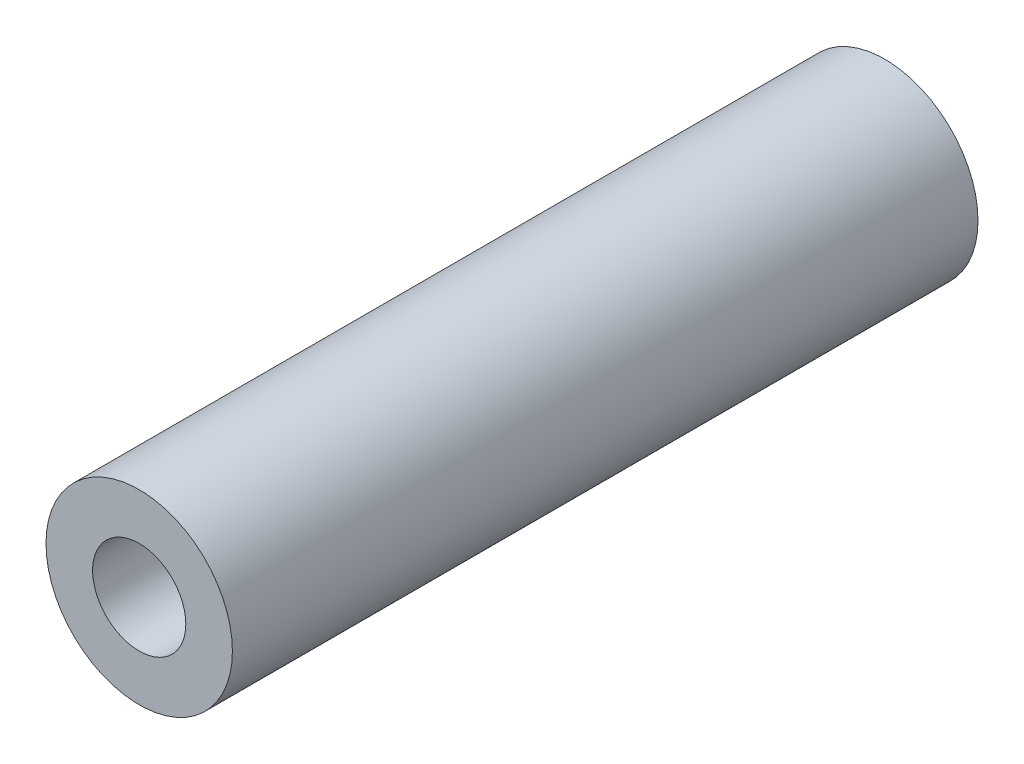
ISO-10303-21;
HEADER;
FILE_DESCRIPTION(('STEP AP214'),'2;1');
FILE_NAME('part.step','',(''),(''),'','','');
FILE_SCHEMA(('AUTOMOTIVE_DESIGN { 1 0 10303 214 1 1 1 1 }'));
ENDSEC;
DATA;
#1=APPLICATION_CONTEXT('core data for automotive mechanical design processes');
#2=APPLICATION_PROTOCOL_DEFINITION('international standard','automotive_design',2000,#1);
#3=PRODUCT_CONTEXT('',#1,'mechanical');
#4=PRODUCT('Part','Part','',(#3));
#5=PRODUCT_RELATED_PRODUCT_CATEGORY('part','',(#4));
#6=PRODUCT_DEFINITION_FORMATION('','',#4);
#7=PRODUCT_DEFINITION_CONTEXT('part definition',#1,'design');
#8=PRODUCT_DEFINITION('design','',#6,#7);
#9=PRODUCT_DEFINITION_SHAPE('','',#8);
#10=(LENGTH_UNIT() NAMED_UNIT(*) SI_UNIT(.MILLI.,.METRE.));
#11=(NAMED_UNIT(*) PLANE_ANGLE_UNIT() SI_UNIT($,.RADIAN.));
#12=(NAMED_UNIT(*) SI_UNIT($,.STERADIAN.) SOLID_ANGLE_UNIT());
#13=UNCERTAINTY_MEASURE_WITH_UNIT(LENGTH_MEASURE(1.E-05),#10,'distance_accuracy_value','');
#14=(GEOMETRIC_REPRESENTATION_CONTEXT(3) GLOBAL_UNCERTAINTY_ASSIGNED_CONTEXT((#13)) GLOBAL_UNIT_ASSIGNED_CONTEXT((#10,
#11,#12)) REPRESENTATION_CONTEXT('',''));
#15=CARTESIAN_POINT('',(0.,0.,0.));
#16=DIRECTION('',(0.,0.,1.));
#17=DIRECTION('',(1.,0.,0.));
#18=AXIS2_PLACEMENT_3D('',#15,#16,#17);
#19=CARTESIAN_POINT('',(0.,0.,10.));
#20=DIRECTION('',(0.,0.,-1.));
#21=DIRECTION('',(-1.,0.,0.));
#22=AXIS2_PLACEMENT_3D('',#19,#20,#21);
#23=CYLINDRICAL_SURFACE('',#22,2.5);
#24=CARTESIAN_POINT('',(0.,0.,10.));
#25=DIRECTION('',(0.,0.,1.));
#26=DIRECTION('',(1.,0.,0.));
#27=AXIS2_PLACEMENT_3D('',#24,#25,#26);
#28=CIRCLE('',#27,2.5);
#29=CARTESIAN_POINT('',(2.5,0.,10.));
#30=VERTEX_POINT('',#29);
#31=EDGE_CURVE('E10',#30,#30,#28,.T.);
#32=ORIENTED_EDGE('',*,*,#31,.F.);
#33=EDGE_LOOP('',(#32));
#34=FACE_BOUND('',#33,.T.);
#35=CARTESIAN_POINT('',(0.,0.,-10.));
#36=DIRECTION('',(0.,0.,1.));
#37=DIRECTION('',(1.,0.,0.));
#38=AXIS2_PLACEMENT_3D('',#35,#36,#37);
#39=CIRCLE('',#38,2.5);
#40=CARTESIAN_POINT('',(2.5,0.,-10.));
#41=VERTEX_POINT('',#40);
#42=EDGE_CURVE('E44',#41,#41,#39,.T.);
#43=ORIENTED_EDGE('',*,*,#42,.T.);
#44=EDGE_LOOP('',(#43));
#45=FACE_BOUND('',#44,.T.);
#46=ADVANCED_FACE('F41',(#34,#45),#23,.T.);
#47=CARTESIAN_POINT('',(0.,0.,10.));
#48=DIRECTION('',(0.,0.,1.));
#49=DIRECTION('',(1.,0.,0.));
#50=AXIS2_PLACEMENT_3D('',#47,#48,#49);
#51=PLANE('',#50);
#52=CARTESIAN_POINT('',(0.,0.,10.));
#53=DIRECTION('',(0.,0.,1.));
#54=DIRECTION('',(1.,0.,0.));
#55=AXIS2_PLACEMENT_3D('',#52,#53,#54);
#56=CIRCLE('',#55,1.24999999999999);
#57=CARTESIAN_POINT('',(1.24999999999999,0.,10.));
#58=VERTEX_POINT('',#57);
#59=EDGE_CURVE('E53',#58,#58,#56,.T.);
#60=ORIENTED_EDGE('',*,*,#59,.F.);
#61=EDGE_LOOP('',(#60));
#62=FACE_BOUND('',#61,.T.);
#63=ORIENTED_EDGE('',*,*,#31,.T.);
#64=EDGE_LOOP('',(#63));
#65=FACE_BOUND('',#64,.T.);
#66=ADVANCED_FACE('F68',(#62,#65),#51,.T.);
#67=CARTESIAN_POINT('',(0.,0.,-10.));
#68=DIRECTION('',(0.,0.,1.));
#69=DIRECTION('',(1.,0.,0.));
#70=AXIS2_PLACEMENT_3D('',#67,#68,#69);
#71=PLANE('',#70);
#72=CARTESIAN_POINT('',(0.,0.,-10.));
#73=DIRECTION('',(0.,0.,-1.));
#74=DIRECTION('',(-1.,0.,0.));
#75=AXIS2_PLACEMENT_3D('',#72,#73,#74);
#76=CIRCLE('',#75,1.24999999999999);
#77=CARTESIAN_POINT('',(-1.24999999999999,0.,-10.));
#78=VERTEX_POINT('',#77);
#79=EDGE_CURVE('E58',#78,#78,#76,.T.);
#80=ORIENTED_EDGE('',*,*,#79,.F.);
#81=EDGE_LOOP('',(#80));
#82=FACE_BOUND('',#81,.T.);
#83=ORIENTED_EDGE('',*,*,#42,.F.);
#84=EDGE_LOOP('',(#83));
#85=FACE_BOUND('',#84,.T.);
#86=ADVANCED_FACE('F65',(#82,#85),#71,.F.);
#87=CARTESIAN_POINT('',(0.,0.,10.));
#88=DIRECTION('',(0.,0.,1.));
#89=DIRECTION('',(1.,0.,0.));
#90=AXIS2_PLACEMENT_3D('',#87,#88,#89);
#91=CYLINDRICAL_SURFACE('',#90,1.24999999999999);
#92=ORIENTED_EDGE('',*,*,#59,.T.);
#93=EDGE_LOOP('',(#92));
#94=FACE_BOUND('',#93,.T.);
#95=ORIENTED_EDGE('',*,*,#79,.T.);
#96=EDGE_LOOP('',(#95));
#97=FACE_BOUND('',#96,.T.);
#98=ADVANCED_FACE('F63',(#94,#97),#91,.F.);
#99=CLOSED_SHELL('',(#46,#66,#86,#98));
#100=MANIFOLD_SOLID_BREP('B2',#99);
#101=ADVANCED_BREP_SHAPE_REPRESENTATION('',(#18,#100),#14);
#102=SHAPE_DEFINITION_REPRESENTATION(#9,#101);
ENDSEC;
END-ISO-10303-21;
